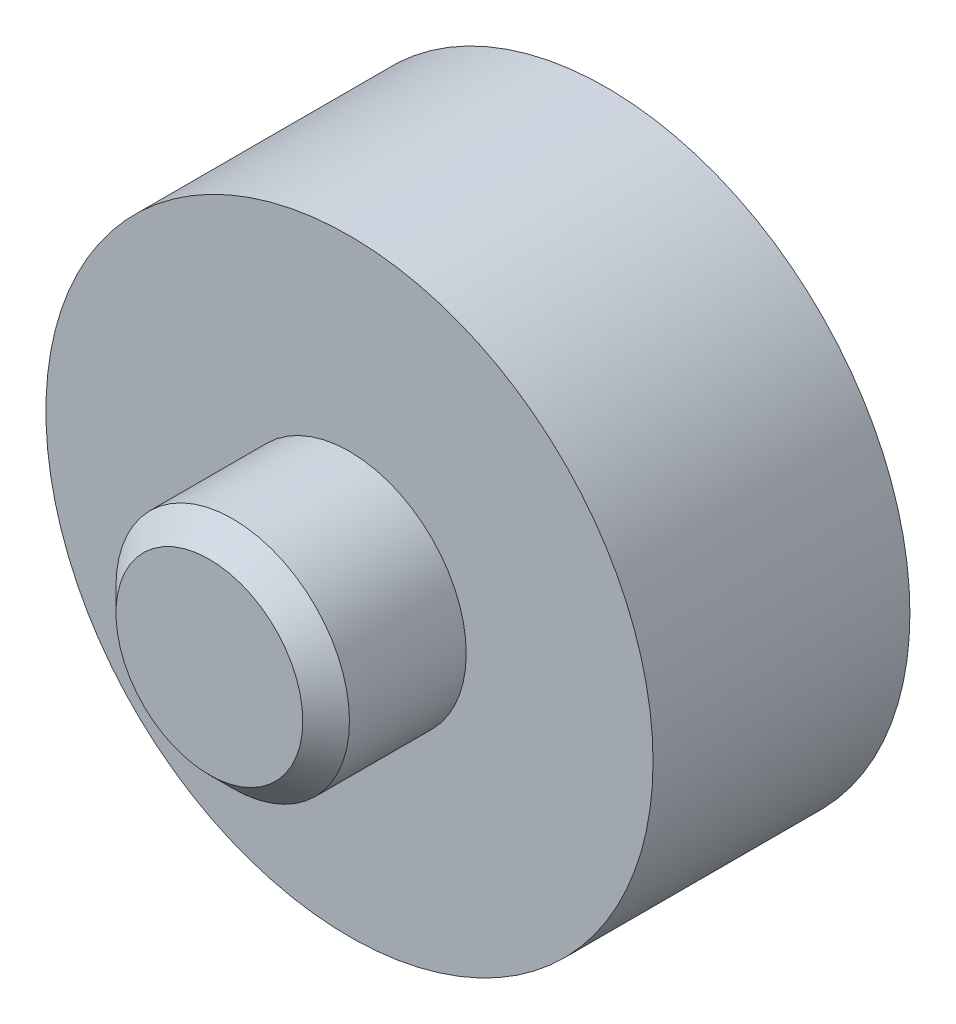
ISO-10303-21;
HEADER;
FILE_DESCRIPTION(('STEP AP214'),'2;1');
FILE_NAME('part.step','',(''),(''),'','','');
FILE_SCHEMA(('AUTOMOTIVE_DESIGN { 1 0 10303 214 1 1 1 1 }'));
ENDSEC;
DATA;
#1=APPLICATION_CONTEXT('core data for automotive mechanical design processes');
#2=APPLICATION_PROTOCOL_DEFINITION('international standard','automotive_design',2000,#1);
#3=PRODUCT_CONTEXT('',#1,'mechanical');
#4=PRODUCT('Part','Part','',(#3));
#5=PRODUCT_RELATED_PRODUCT_CATEGORY('part','',(#4));
#6=PRODUCT_DEFINITION_FORMATION('','',#4);
#7=PRODUCT_DEFINITION_CONTEXT('part definition',#1,'design');
#8=PRODUCT_DEFINITION('design','',#6,#7);
#9=PRODUCT_DEFINITION_SHAPE('','',#8);
#10=(LENGTH_UNIT() NAMED_UNIT(*) SI_UNIT(.MILLI.,.METRE.));
#11=(NAMED_UNIT(*) PLANE_ANGLE_UNIT() SI_UNIT($,.RADIAN.));
#12=(NAMED_UNIT(*) SI_UNIT($,.STERADIAN.) SOLID_ANGLE_UNIT());
#13=UNCERTAINTY_MEASURE_WITH_UNIT(LENGTH_MEASURE(1.E-05),#10,'distance_accuracy_value','');
#14=(GEOMETRIC_REPRESENTATION_CONTEXT(3) GLOBAL_UNCERTAINTY_ASSIGNED_CONTEXT((#13)) GLOBAL_UNIT_ASSIGNED_CONTEXT((#10,
#11,#12)) REPRESENTATION_CONTEXT('',''));
#15=CARTESIAN_POINT('',(0.,0.,0.));
#16=DIRECTION('',(0.,0.,1.));
#17=DIRECTION('',(1.,0.,0.));
#18=AXIS2_PLACEMENT_3D('',#15,#16,#17);
#19=CARTESIAN_POINT('',(0.,0.,0.));
#20=DIRECTION('',(0.,0.,1.));
#21=DIRECTION('',(1.,0.,0.));
#22=AXIS2_PLACEMENT_3D('',#19,#20,#21);
#23=PLANE('',#22);
#24=CARTESIAN_POINT('',(0.,0.,0.));
#25=DIRECTION('',(0.,0.,1.));
#26=DIRECTION('',(1.,0.,0.));
#27=AXIS2_PLACEMENT_3D('',#24,#25,#26);
#28=CIRCLE('',#27,6.5);
#29=CARTESIAN_POINT('',(6.5,0.,0.));
#30=VERTEX_POINT('',#29);
#31=EDGE_CURVE('E49',#30,#30,#28,.T.);
#32=ORIENTED_EDGE('',*,*,#31,.F.);
#33=EDGE_LOOP('',(#32));
#34=FACE_BOUND('',#33,.T.);
#35=CARTESIAN_POINT('',(0.,0.,0.));
#36=DIRECTION('',(0.,0.,1.));
#37=DIRECTION('',(1.,0.,0.));
#38=AXIS2_PLACEMENT_3D('',#35,#36,#37);
#39=CIRCLE('',#38,2.75);
#40=CARTESIAN_POINT('',(2.75,0.,0.));
#41=VERTEX_POINT('',#40);
#42=EDGE_CURVE('E54',#41,#41,#39,.T.);
#43=ORIENTED_EDGE('',*,*,#42,.T.);
#44=EDGE_LOOP('',(#43));
#45=FACE_BOUND('',#44,.T.);
#46=ADVANCED_FACE('F33',(#34,#45),#23,.F.);
#47=CARTESIAN_POINT('',(0.,0.,3.5));
#48=DIRECTION('',(0.,0.,-1.));
#49=DIRECTION('',(-1.,0.,0.));
#50=AXIS2_PLACEMENT_3D('',#47,#48,#49);
#51=CYLINDRICAL_SURFACE('',#50,6.5);
#52=ORIENTED_EDGE('',*,*,#31,.T.);
#53=EDGE_LOOP('',(#52));
#54=FACE_BOUND('',#53,.T.);
#55=CARTESIAN_POINT('',(0.,0.,5.5));
#56=DIRECTION('',(0.,0.,1.));
#57=DIRECTION('',(1.,0.,0.));
#58=AXIS2_PLACEMENT_3D('',#55,#56,#57);
#59=CIRCLE('',#58,6.5);
#60=CARTESIAN_POINT('',(6.5,0.,5.5));
#61=VERTEX_POINT('',#60);
#62=EDGE_CURVE('E60',#61,#61,#59,.T.);
#63=ORIENTED_EDGE('',*,*,#62,.F.);
#64=EDGE_LOOP('',(#63));
#65=FACE_BOUND('',#64,.T.);
#66=ADVANCED_FACE('F66',(#54,#65),#51,.T.);
#67=CARTESIAN_POINT('',(0.,0.,3.5));
#68=DIRECTION('',(0.,0.,-1.));
#69=DIRECTION('',(-1.,0.,0.));
#70=AXIS2_PLACEMENT_3D('',#67,#68,#69);
#71=CYLINDRICAL_SURFACE('',#70,2.75);
#72=CARTESIAN_POINT('',(0.,0.,3.5));
#73=DIRECTION('',(0.,0.,1.));
#74=DIRECTION('',(1.,0.,0.));
#75=AXIS2_PLACEMENT_3D('',#72,#73,#74);
#76=CIRCLE('',#75,2.75);
#77=CARTESIAN_POINT('',(2.75,0.,3.5));
#78=VERTEX_POINT('',#77);
#79=EDGE_CURVE('E57',#78,#78,#76,.T.);
#80=ORIENTED_EDGE('',*,*,#79,.T.);
#81=EDGE_LOOP('',(#80));
#82=FACE_BOUND('',#81,.T.);
#83=ORIENTED_EDGE('',*,*,#42,.F.);
#84=EDGE_LOOP('',(#83));
#85=FACE_BOUND('',#84,.T.);
#86=ADVANCED_FACE('F68',(#82,#85),#71,.F.);
#87=CARTESIAN_POINT('',(0.,0.,3.5));
#88=DIRECTION('',(0.,0.,1.));
#89=DIRECTION('',(1.,0.,0.));
#90=AXIS2_PLACEMENT_3D('',#87,#88,#89);
#91=PLANE('',#90);
#92=ORIENTED_EDGE('',*,*,#79,.F.);
#93=EDGE_LOOP('',(#92));
#94=FACE_BOUND('',#93,.T.);
#95=ADVANCED_FACE('F74',(#94),#91,.F.);
#96=CARTESIAN_POINT('',(0.,0.,5.5));
#97=DIRECTION('',(0.,0.,1.));
#98=DIRECTION('',(1.,0.,0.));
#99=AXIS2_PLACEMENT_3D('',#96,#97,#98);
#100=PLANE('',#99);
#101=CARTESIAN_POINT('',(0.,0.,5.5));
#102=DIRECTION('',(0.,0.,1.));
#103=DIRECTION('',(1.,0.,0.));
#104=AXIS2_PLACEMENT_3D('',#101,#102,#103);
#105=CIRCLE('',#104,2.5);
#106=CARTESIAN_POINT('',(2.5,0.,5.5));
#107=VERTEX_POINT('',#106);
#108=EDGE_CURVE('E45',#107,#107,#105,.T.);
#109=ORIENTED_EDGE('',*,*,#108,.F.);
#110=EDGE_LOOP('',(#109));
#111=FACE_BOUND('',#110,.T.);
#112=ORIENTED_EDGE('',*,*,#62,.T.);
#113=EDGE_LOOP('',(#112));
#114=FACE_BOUND('',#113,.T.);
#115=ADVANCED_FACE('F64',(#111,#114),#100,.T.);
#116=CARTESIAN_POINT('',(0.,0.,8.5));
#117=DIRECTION('',(0.,0.,-1.));
#118=DIRECTION('',(-1.,0.,0.));
#119=AXIS2_PLACEMENT_3D('',#116,#117,#118);
#120=CYLINDRICAL_SURFACE('',#119,2.5);
#121=CARTESIAN_POINT('',(0.,0.,8.));
#122=DIRECTION('',(0.,0.,1.));
#123=DIRECTION('',(1.,0.,0.));
#124=AXIS2_PLACEMENT_3D('',#121,#122,#123);
#125=CIRCLE('',#124,2.5);
#126=CARTESIAN_POINT('',(2.5,0.,8.));
#127=VERTEX_POINT('',#126);
#128=EDGE_CURVE('E10',#127,#127,#125,.F.);
#129=ORIENTED_EDGE('',*,*,#128,.T.);
#130=EDGE_LOOP('',(#129));
#131=FACE_BOUND('',#130,.T.);
#132=ORIENTED_EDGE('',*,*,#108,.T.);
#133=EDGE_LOOP('',(#132));
#134=FACE_BOUND('',#133,.T.);
#135=ADVANCED_FACE('F85',(#131,#134),#120,.T.);
#136=CARTESIAN_POINT('',(0.,0.,8.5));
#137=DIRECTION('',(0.,0.,1.));
#138=DIRECTION('',(1.,0.,0.));
#139=AXIS2_PLACEMENT_3D('',#136,#137,#138);
#140=PLANE('',#139);
#141=CARTESIAN_POINT('',(0.,0.,8.5));
#142=DIRECTION('',(0.,0.,1.));
#143=DIRECTION('',(1.,0.,0.));
#144=AXIS2_PLACEMENT_3D('',#141,#142,#143);
#145=CIRCLE('',#144,2.);
#146=CARTESIAN_POINT('',(2.,0.,8.5));
#147=VERTEX_POINT('',#146);
#148=EDGE_CURVE('E41',#147,#147,#145,.T.);
#149=ORIENTED_EDGE('',*,*,#148,.T.);
#150=EDGE_LOOP('',(#149));
#151=FACE_BOUND('',#150,.T.);
#152=ADVANCED_FACE('F89',(#151),#140,.T.);
#153=CARTESIAN_POINT('',(0.,0.,8.5));
#154=DIRECTION('',(0.,0.,-1.));
#155=DIRECTION('',(-1.,0.,0.));
#156=AXIS2_PLACEMENT_3D('',#153,#154,#155);
#157=CONICAL_SURFACE('',#156,2.,0.785398163397446);
#158=ORIENTED_EDGE('',*,*,#128,.F.);
#159=EDGE_LOOP('',(#158));
#160=FACE_BOUND('',#159,.T.);
#161=ORIENTED_EDGE('',*,*,#148,.F.);
#162=EDGE_LOOP('',(#161));
#163=FACE_BOUND('',#162,.T.);
#164=ADVANCED_FACE('F36',(#160,#163),#157,.T.);
#165=CLOSED_SHELL('',(#46,#66,#86,#95,#115,#135,#152,#164));
#166=MANIFOLD_SOLID_BREP('B2',#165);
#167=ADVANCED_BREP_SHAPE_REPRESENTATION('',(#18,#166),#14);
#168=SHAPE_DEFINITION_REPRESENTATION(#9,#167);
ENDSEC;
END-ISO-10303-21;
